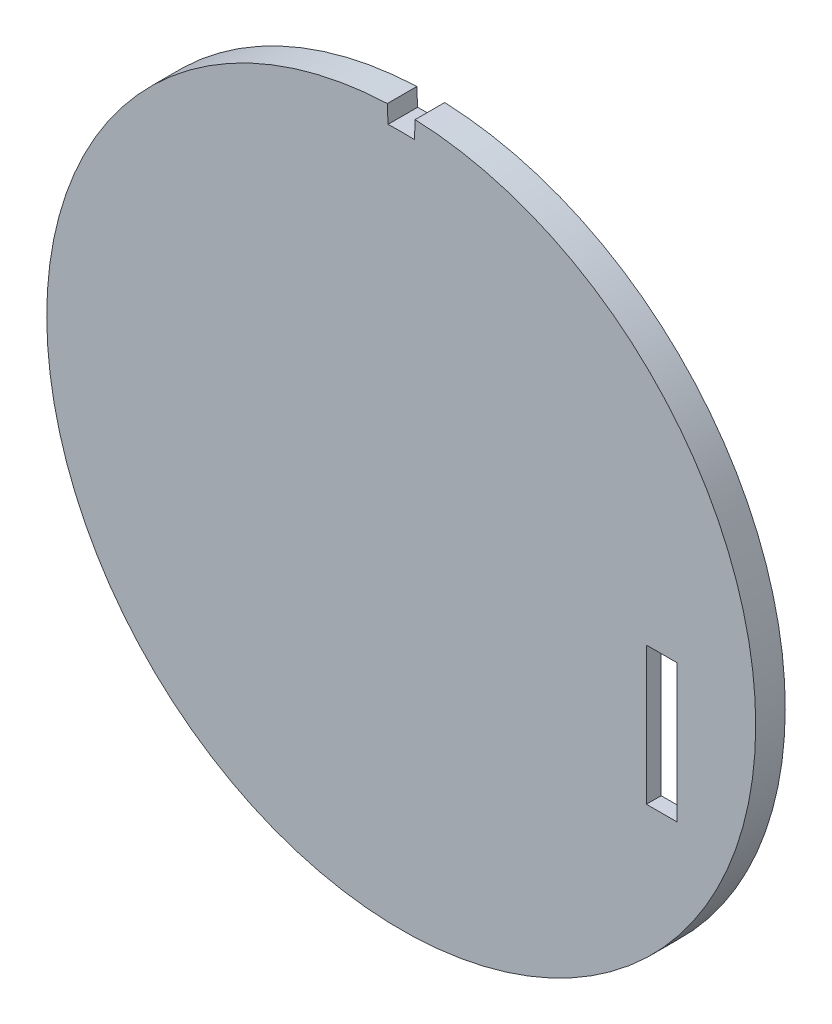
ISO-10303-21;
HEADER;
FILE_DESCRIPTION(('STEP AP214'),'2;1');
FILE_NAME('part.step','',(''),(''),'','','');
FILE_SCHEMA(('AUTOMOTIVE_DESIGN { 1 0 10303 214 1 1 1 1 }'));
ENDSEC;
DATA;
#1=APPLICATION_CONTEXT('core data for automotive mechanical design processes');
#2=APPLICATION_PROTOCOL_DEFINITION('international standard','automotive_design',2000,#1);
#3=PRODUCT_CONTEXT('',#1,'mechanical');
#4=PRODUCT('Part','Part','',(#3));
#5=PRODUCT_RELATED_PRODUCT_CATEGORY('part','',(#4));
#6=PRODUCT_DEFINITION_FORMATION('','',#4);
#7=PRODUCT_DEFINITION_CONTEXT('part definition',#1,'design');
#8=PRODUCT_DEFINITION('design','',#6,#7);
#9=PRODUCT_DEFINITION_SHAPE('','',#8);
#10=(LENGTH_UNIT() NAMED_UNIT(*) SI_UNIT(.MILLI.,.METRE.));
#11=(NAMED_UNIT(*) PLANE_ANGLE_UNIT() SI_UNIT($,.RADIAN.));
#12=(NAMED_UNIT(*) SI_UNIT($,.STERADIAN.) SOLID_ANGLE_UNIT());
#13=UNCERTAINTY_MEASURE_WITH_UNIT(LENGTH_MEASURE(1.E-05),#10,'distance_accuracy_value','');
#14=(GEOMETRIC_REPRESENTATION_CONTEXT(3) GLOBAL_UNCERTAINTY_ASSIGNED_CONTEXT((#13)) GLOBAL_UNIT_ASSIGNED_CONTEXT((#10,
#11,#12)) REPRESENTATION_CONTEXT('',''));
#15=CARTESIAN_POINT('',(0.,0.,0.));
#16=DIRECTION('',(0.,0.,1.));
#17=DIRECTION('',(1.,0.,0.));
#18=AXIS2_PLACEMENT_3D('',#15,#16,#17);
#19=CARTESIAN_POINT('',(-28.,0.,-3.));
#20=DIRECTION('',(1.,0.,0.));
#21=DIRECTION('',(0.,0.,-1.));
#22=AXIS2_PLACEMENT_3D('',#19,#20,#21);
#23=PLANE('',#22);
#24=DIRECTION('',(0.,0.,1.));
#25=VECTOR('',#24,1.);
#26=CARTESIAN_POINT('',(-28.,4.5,-3.));
#27=LINE('',#26,#25);
#28=CARTESIAN_POINT('',(-28.,4.5,-3.));
#29=VERTEX_POINT('',#28);
#30=CARTESIAN_POINT('',(-28.,4.5,-1.5));
#31=VERTEX_POINT('',#30);
#32=EDGE_CURVE('E36',#29,#31,#27,.T.);
#33=ORIENTED_EDGE('',*,*,#32,.T.);
#34=DIRECTION('',(0.,1.,0.));
#35=VECTOR('',#34,1.);
#36=CARTESIAN_POINT('',(-28.,0.,-1.5));
#37=LINE('',#36,#35);
#38=CARTESIAN_POINT('',(-28.,-17.,-1.5));
#39=VERTEX_POINT('',#38);
#40=EDGE_CURVE('E159',#39,#31,#37,.T.);
#41=ORIENTED_EDGE('',*,*,#40,.F.);
#42=DIRECTION('',(0.,0.,1.));
#43=VECTOR('',#42,1.);
#44=CARTESIAN_POINT('',(-28.,-17.,-3.));
#45=LINE('',#44,#43);
#46=CARTESIAN_POINT('',(-28.,-17.,-3.));
#47=VERTEX_POINT('',#46);
#48=EDGE_CURVE('E140',#47,#39,#45,.T.);
#49=ORIENTED_EDGE('',*,*,#48,.F.);
#50=DIRECTION('',(0.,1.,0.));
#51=VECTOR('',#50,1.);
#52=CARTESIAN_POINT('',(-28.,0.,-3.));
#53=LINE('',#52,#51);
#54=EDGE_CURVE('E136',#47,#29,#53,.T.);
#55=ORIENTED_EDGE('',*,*,#54,.T.);
#56=EDGE_LOOP('',(#33,#41,#49,#55));
#57=FACE_BOUND('',#56,.T.);
#58=ADVANCED_FACE('F33',(#57),#23,.T.);
#59=CARTESIAN_POINT('',(-22.4999999999999,-22.5,-3.));
#60=DIRECTION('',(0.707106781186546,0.707106781186549,0.));
#61=DIRECTION('',(-0.707106781186549,0.707106781186546,0.));
#62=AXIS2_PLACEMENT_3D('',#59,#60,#61);
#63=PLANE('',#62);
#64=ORIENTED_EDGE('',*,*,#48,.T.);
#65=DIRECTION('',(-0.707106781186549,0.707106781186546,0.));
#66=VECTOR('',#65,1.);
#67=CARTESIAN_POINT('',(-22.4999999999999,-22.5,-1.5));
#68=LINE('',#67,#66);
#69=CARTESIAN_POINT('',(-21.5,-23.5,-1.5));
#70=VERTEX_POINT('',#69);
#71=EDGE_CURVE('E397',#70,#39,#68,.T.);
#72=ORIENTED_EDGE('',*,*,#71,.F.);
#73=DIRECTION('',(0.,0.,1.));
#74=VECTOR('',#73,1.);
#75=CARTESIAN_POINT('',(-21.5,-23.5,-3.));
#76=LINE('',#75,#74);
#77=CARTESIAN_POINT('',(-21.5,-23.5,-3.));
#78=VERTEX_POINT('',#77);
#79=EDGE_CURVE('E143',#78,#70,#76,.T.);
#80=ORIENTED_EDGE('',*,*,#79,.F.);
#81=DIRECTION('',(-0.707106781186549,0.707106781186546,0.));
#82=VECTOR('',#81,1.);
#83=CARTESIAN_POINT('',(-22.4999999999999,-22.5,-3.));
#84=LINE('',#83,#82);
#85=EDGE_CURVE('E245',#78,#47,#84,.T.);
#86=ORIENTED_EDGE('',*,*,#85,.T.);
#87=EDGE_LOOP('',(#64,#72,#80,#86));
#88=FACE_BOUND('',#87,.T.);
#89=ADVANCED_FACE('F262',(#88),#63,.T.);
#90=CARTESIAN_POINT('',(0.,-23.5,-3.));
#91=DIRECTION('',(0.,1.,0.));
#92=DIRECTION('',(-1.,0.,0.));
#93=AXIS2_PLACEMENT_3D('',#90,#91,#92);
#94=PLANE('',#93);
#95=ORIENTED_EDGE('',*,*,#79,.T.);
#96=DIRECTION('',(-1.,0.,0.));
#97=VECTOR('',#96,1.);
#98=CARTESIAN_POINT('',(0.,-23.5,-1.5));
#99=LINE('',#98,#97);
#100=CARTESIAN_POINT('',(21.5,-23.5,-1.5));
#101=VERTEX_POINT('',#100);
#102=EDGE_CURVE('E395',#101,#70,#99,.T.);
#103=ORIENTED_EDGE('',*,*,#102,.F.);
#104=DIRECTION('',(0.,0.,1.));
#105=VECTOR('',#104,1.);
#106=CARTESIAN_POINT('',(21.5,-23.5,-3.));
#107=LINE('',#106,#105);
#108=CARTESIAN_POINT('',(21.5,-23.5,-3.));
#109=VERTEX_POINT('',#108);
#110=EDGE_CURVE('E146',#109,#101,#107,.T.);
#111=ORIENTED_EDGE('',*,*,#110,.F.);
#112=DIRECTION('',(-1.,0.,0.));
#113=VECTOR('',#112,1.);
#114=CARTESIAN_POINT('',(0.,-23.5,-3.));
#115=LINE('',#114,#113);
#116=EDGE_CURVE('E242',#109,#78,#115,.T.);
#117=ORIENTED_EDGE('',*,*,#116,.T.);
#118=EDGE_LOOP('',(#95,#103,#111,#117));
#119=FACE_BOUND('',#118,.T.);
#120=ADVANCED_FACE('F266',(#119),#94,.T.);
#121=CARTESIAN_POINT('',(22.5,-22.5,-3.));
#122=DIRECTION('',(-0.707106781186546,0.707106781186548,0.));
#123=DIRECTION('',(-0.707106781186549,-0.707106781186546,0.));
#124=AXIS2_PLACEMENT_3D('',#121,#122,#123);
#125=PLANE('',#124);
#126=ORIENTED_EDGE('',*,*,#110,.T.);
#127=DIRECTION('',(-0.707106781186549,-0.707106781186546,0.));
#128=VECTOR('',#127,1.);
#129=CARTESIAN_POINT('',(22.5,-22.5,-1.5));
#130=LINE('',#129,#128);
#131=CARTESIAN_POINT('',(28.,-17.,-1.5));
#132=VERTEX_POINT('',#131);
#133=EDGE_CURVE('E393',#132,#101,#130,.T.);
#134=ORIENTED_EDGE('',*,*,#133,.F.);
#135=DIRECTION('',(0.,0.,1.));
#136=VECTOR('',#135,1.);
#137=CARTESIAN_POINT('',(28.,-17.,-3.));
#138=LINE('',#137,#136);
#139=CARTESIAN_POINT('',(28.,-17.,-3.));
#140=VERTEX_POINT('',#139);
#141=EDGE_CURVE('E149',#140,#132,#138,.T.);
#142=ORIENTED_EDGE('',*,*,#141,.F.);
#143=DIRECTION('',(-0.707106781186549,-0.707106781186546,0.));
#144=VECTOR('',#143,1.);
#145=CARTESIAN_POINT('',(22.5,-22.5,-3.));
#146=LINE('',#145,#144);
#147=EDGE_CURVE('E239',#140,#109,#146,.T.);
#148=ORIENTED_EDGE('',*,*,#147,.T.);
#149=EDGE_LOOP('',(#126,#134,#142,#148));
#150=FACE_BOUND('',#149,.T.);
#151=ADVANCED_FACE('F272',(#150),#125,.T.);
#152=CARTESIAN_POINT('',(28.,0.,-3.));
#153=DIRECTION('',(-1.,0.,0.));
#154=DIRECTION('',(0.,-1.,0.));
#155=AXIS2_PLACEMENT_3D('',#152,#153,#154);
#156=PLANE('',#155);
#157=DIRECTION('',(0.,-1.,0.));
#158=VECTOR('',#157,1.);
#159=CARTESIAN_POINT('',(28.,0.,-1.5));
#160=LINE('',#159,#158);
#161=CARTESIAN_POINT('',(28.,-12.5,-1.5));
#162=VERTEX_POINT('',#161);
#163=EDGE_CURVE('E389',#162,#132,#160,.T.);
#164=ORIENTED_EDGE('',*,*,#163,.F.);
#165=DIRECTION('',(0.,0.,1.));
#166=VECTOR('',#165,1.);
#167=CARTESIAN_POINT('',(28.,-12.5,-1.5));
#168=LINE('',#167,#166);
#169=CARTESIAN_POINT('',(28.,-12.5,0.));
#170=VERTEX_POINT('',#169);
#171=EDGE_CURVE('E229',#162,#170,#168,.T.);
#172=ORIENTED_EDGE('',*,*,#171,.T.);
#173=DIRECTION('',(0.,-1.,0.));
#174=VECTOR('',#173,1.);
#175=CARTESIAN_POINT('',(28.,0.,0.));
#176=LINE('',#175,#174);
#177=CARTESIAN_POINT('',(28.,1.5,0.));
#178=VERTEX_POINT('',#177);
#179=EDGE_CURVE('E126',#178,#170,#176,.T.);
#180=ORIENTED_EDGE('',*,*,#179,.F.);
#181=DIRECTION('',(0.,0.,1.));
#182=VECTOR('',#181,1.);
#183=CARTESIAN_POINT('',(28.,1.5,-1.5));
#184=LINE('',#183,#182);
#185=CARTESIAN_POINT('',(28.,1.5,-1.5));
#186=VERTEX_POINT('',#185);
#187=EDGE_CURVE('E130',#186,#178,#184,.T.);
#188=ORIENTED_EDGE('',*,*,#187,.F.);
#189=CARTESIAN_POINT('',(28.,4.5,-1.5));
#190=VERTEX_POINT('',#189);
#191=EDGE_CURVE('E232',#190,#186,#160,.T.);
#192=ORIENTED_EDGE('',*,*,#191,.F.);
#193=DIRECTION('',(0.,0.,1.));
#194=VECTOR('',#193,1.);
#195=CARTESIAN_POINT('',(28.,4.5,-3.));
#196=LINE('',#195,#194);
#197=CARTESIAN_POINT('',(28.,4.5,-3.));
#198=VERTEX_POINT('',#197);
#199=EDGE_CURVE('E151',#198,#190,#196,.T.);
#200=ORIENTED_EDGE('',*,*,#199,.F.);
#201=DIRECTION('',(0.,-1.,0.));
#202=VECTOR('',#201,1.);
#203=CARTESIAN_POINT('',(28.,0.,-3.));
#204=LINE('',#203,#202);
#205=EDGE_CURVE('E236',#198,#140,#204,.T.);
#206=ORIENTED_EDGE('',*,*,#205,.T.);
#207=ORIENTED_EDGE('',*,*,#141,.T.);
#208=EDGE_LOOP('',(#164,#172,#180,#188,#192,#200,#206,#207));
#209=FACE_BOUND('',#208,.T.);
#210=ADVANCED_FACE('F280',(#209),#156,.T.);
#211=CARTESIAN_POINT('',(0.,4.5,-3.));
#212=DIRECTION('',(0.,-1.,0.));
#213=DIRECTION('',(1.,0.,0.));
#214=AXIS2_PLACEMENT_3D('',#211,#212,#213);
#215=PLANE('',#214);
#216=ORIENTED_EDGE('',*,*,#199,.T.);
#217=DIRECTION('',(1.,0.,0.));
#218=VECTOR('',#217,1.);
#219=CARTESIAN_POINT('',(0.,4.5,-1.5));
#220=LINE('',#219,#218);
#221=EDGE_CURVE('E210',#31,#190,#220,.T.);
#222=ORIENTED_EDGE('',*,*,#221,.F.);
#223=ORIENTED_EDGE('',*,*,#32,.F.);
#224=DIRECTION('',(1.,0.,0.));
#225=VECTOR('',#224,1.);
#226=CARTESIAN_POINT('',(0.,4.5,-3.));
#227=LINE('',#226,#225);
#228=EDGE_CURVE('E234',#29,#198,#227,.T.);
#229=ORIENTED_EDGE('',*,*,#228,.T.);
#230=EDGE_LOOP('',(#216,#222,#223,#229));
#231=FACE_BOUND('',#230,.T.);
#232=ADVANCED_FACE('F283',(#231),#215,.T.);
#233=CARTESIAN_POINT('',(0.,0.,-3.));
#234=DIRECTION('',(0.,0.,1.));
#235=DIRECTION('',(1.,0.,0.));
#236=AXIS2_PLACEMENT_3D('',#233,#234,#235);
#237=CYLINDRICAL_SURFACE('',#236,34.2);
#238=CARTESIAN_POINT('',(0.,0.,0.));
#239=DIRECTION('',(0.,0.,1.));
#240=DIRECTION('',(1.,0.,0.));
#241=AXIS2_PLACEMENT_3D('',#238,#239,#240);
#242=CIRCLE('',#241,34.2);
#243=CARTESIAN_POINT('',(-1.34268569896003,34.1736330394327,0.));
#244=VERTEX_POINT('',#243);
#245=CARTESIAN_POINT('',(1.34268569896004,34.1736330394327,0.));
#246=VERTEX_POINT('',#245);
#247=EDGE_CURVE('E129',#244,#246,#242,.F.);
#248=ORIENTED_EDGE('',*,*,#247,.T.);
#249=DIRECTION('',(0.,0.,1.));
#250=VECTOR('',#249,1.);
#251=CARTESIAN_POINT('',(1.34268569896004,34.1736330394327,-3.));
#252=LINE('',#251,#250);
#253=CARTESIAN_POINT('',(1.34268569896004,34.1736330394327,-3.));
#254=VERTEX_POINT('',#253);
#255=EDGE_CURVE('E11',#254,#246,#252,.T.);
#256=ORIENTED_EDGE('',*,*,#255,.F.);
#257=CARTESIAN_POINT('',(0.,0.,-3.));
#258=DIRECTION('',(0.,0.,1.));
#259=DIRECTION('',(1.,0.,0.));
#260=AXIS2_PLACEMENT_3D('',#257,#258,#259);
#261=CIRCLE('',#260,34.2);
#262=CARTESIAN_POINT('',(-1.34268569896003,34.1736330394327,-3.));
#263=VERTEX_POINT('',#262);
#264=EDGE_CURVE('E119',#263,#254,#261,.F.);
#265=ORIENTED_EDGE('',*,*,#264,.F.);
#266=DIRECTION('',(0.,0.,1.));
#267=VECTOR('',#266,1.);
#268=CARTESIAN_POINT('',(-1.34268569896003,34.1736330394327,-3.));
#269=LINE('',#268,#267);
#270=EDGE_CURVE('E111',#263,#244,#269,.T.);
#271=ORIENTED_EDGE('',*,*,#270,.T.);
#272=EDGE_LOOP('',(#248,#256,#265,#271));
#273=FACE_BOUND('',#272,.T.);
#274=ADVANCED_FACE('F249',(#273),#237,.T.);
#275=CARTESIAN_POINT('',(-2.32490406242338E-13,0.,-3.));
#276=DIRECTION('',(0.999229036240723,-0.0392598157590722,0.));
#277=DIRECTION('',(0.0392598157590722,0.999229036240723,0.));
#278=AXIS2_PLACEMENT_3D('',#275,#276,#277);
#279=PLANE('',#278);
#280=DIRECTION('',(0.0392598157590722,0.999229036240723,0.));
#281=VECTOR('',#280,1.);
#282=CARTESIAN_POINT('',(-2.32490406242338E-13,0.,0.));
#283=LINE('',#282,#281);
#284=CARTESIAN_POINT('',(1.41335336732637,35.972245304666,0.));
#285=VERTEX_POINT('',#284);
#286=EDGE_CURVE('E73',#246,#285,#283,.T.);
#287=ORIENTED_EDGE('',*,*,#286,.T.);
#288=DIRECTION('',(0.,0.,1.));
#289=VECTOR('',#288,1.);
#290=CARTESIAN_POINT('',(1.41335336732637,35.972245304666,-3.));
#291=LINE('',#290,#289);
#292=CARTESIAN_POINT('',(1.41335336732637,35.972245304666,-3.));
#293=VERTEX_POINT('',#292);
#294=EDGE_CURVE('E42',#293,#285,#291,.T.);
#295=ORIENTED_EDGE('',*,*,#294,.F.);
#296=DIRECTION('',(0.0392598157590722,0.999229036240723,0.));
#297=VECTOR('',#296,1.);
#298=CARTESIAN_POINT('',(-2.32490406242338E-13,0.,-3.));
#299=LINE('',#298,#297);
#300=EDGE_CURVE('E50',#254,#293,#299,.T.);
#301=ORIENTED_EDGE('',*,*,#300,.F.);
#302=ORIENTED_EDGE('',*,*,#255,.T.);
#303=EDGE_LOOP('',(#287,#295,#301,#302));
#304=FACE_BOUND('',#303,.T.);
#305=ADVANCED_FACE('F250',(#304),#279,.F.);
#306=CARTESIAN_POINT('',(0.,0.,-3.));
#307=DIRECTION('',(0.,0.,1.));
#308=DIRECTION('',(1.,0.,0.));
#309=AXIS2_PLACEMENT_3D('',#306,#307,#308);
#310=CYLINDRICAL_SURFACE('',#309,36.);
#311=CARTESIAN_POINT('',(0.,0.,0.));
#312=DIRECTION('',(0.,0.,1.));
#313=DIRECTION('',(1.,0.,0.));
#314=AXIS2_PLACEMENT_3D('',#311,#312,#313);
#315=CIRCLE('',#314,36.);
#316=CARTESIAN_POINT('',(-1.41335336732635,35.972245304666,0.));
#317=VERTEX_POINT('',#316);
#318=EDGE_CURVE('E108',#317,#285,#315,.T.);
#319=ORIENTED_EDGE('',*,*,#318,.F.);
#320=DIRECTION('',(0.,0.,1.));
#321=VECTOR('',#320,1.);
#322=CARTESIAN_POINT('',(-1.41335336732635,35.972245304666,-3.));
#323=LINE('',#322,#321);
#324=CARTESIAN_POINT('',(-1.41335336732635,35.972245304666,-3.));
#325=VERTEX_POINT('',#324);
#326=EDGE_CURVE('E103',#325,#317,#323,.T.);
#327=ORIENTED_EDGE('',*,*,#326,.F.);
#328=CARTESIAN_POINT('',(0.,0.,-3.));
#329=DIRECTION('',(0.,0.,1.));
#330=DIRECTION('',(1.,0.,0.));
#331=AXIS2_PLACEMENT_3D('',#328,#329,#330);
#332=CIRCLE('',#331,36.);
#333=EDGE_CURVE('E107',#325,#293,#332,.T.);
#334=ORIENTED_EDGE('',*,*,#333,.T.);
#335=ORIENTED_EDGE('',*,*,#294,.T.);
#336=EDGE_LOOP('',(#319,#327,#334,#335));
#337=FACE_BOUND('',#336,.T.);
#338=ADVANCED_FACE('F105',(#337),#310,.T.);
#339=CARTESIAN_POINT('',(0.,0.,-3.));
#340=DIRECTION('',(-0.999229036240723,-0.0392598157590649,0.));
#341=DIRECTION('',(0.0392598157590649,-0.999229036240723,0.));
#342=AXIS2_PLACEMENT_3D('',#339,#340,#341);
#343=PLANE('',#342);
#344=DIRECTION('',(0.0392598157590649,-0.999229036240723,0.));
#345=VECTOR('',#344,1.);
#346=CARTESIAN_POINT('',(0.,0.,0.));
#347=LINE('',#346,#345);
#348=EDGE_CURVE('E133',#317,#244,#347,.T.);
#349=ORIENTED_EDGE('',*,*,#348,.T.);
#350=ORIENTED_EDGE('',*,*,#270,.F.);
#351=DIRECTION('',(0.0392598157590649,-0.999229036240723,0.));
#352=VECTOR('',#351,1.);
#353=CARTESIAN_POINT('',(0.,0.,-3.));
#354=LINE('',#353,#352);
#355=EDGE_CURVE('E114',#325,#263,#354,.T.);
#356=ORIENTED_EDGE('',*,*,#355,.F.);
#357=ORIENTED_EDGE('',*,*,#326,.T.);
#358=EDGE_LOOP('',(#349,#350,#356,#357));
#359=FACE_BOUND('',#358,.T.);
#360=ADVANCED_FACE('F115',(#359),#343,.F.);
#361=CARTESIAN_POINT('',(0.,0.,-3.));
#362=DIRECTION('',(0.,0.,1.));
#363=DIRECTION('',(1.,0.,0.));
#364=AXIS2_PLACEMENT_3D('',#361,#362,#363);
#365=PLANE('',#364);
#366=ORIENTED_EDGE('',*,*,#54,.F.);
#367=ORIENTED_EDGE('',*,*,#85,.F.);
#368=ORIENTED_EDGE('',*,*,#116,.F.);
#369=ORIENTED_EDGE('',*,*,#147,.F.);
#370=ORIENTED_EDGE('',*,*,#205,.F.);
#371=ORIENTED_EDGE('',*,*,#228,.F.);
#372=EDGE_LOOP('',(#366,#367,#368,#369,#370,#371));
#373=FACE_BOUND('',#372,.T.);
#374=ORIENTED_EDGE('',*,*,#264,.T.);
#375=ORIENTED_EDGE('',*,*,#300,.T.);
#376=ORIENTED_EDGE('',*,*,#333,.F.);
#377=ORIENTED_EDGE('',*,*,#355,.T.);
#378=EDGE_LOOP('',(#374,#375,#376,#377));
#379=FACE_BOUND('',#378,.T.);
#380=ADVANCED_FACE('F121',(#373,#379),#365,.F.);
#381=CARTESIAN_POINT('',(0.,0.,0.));
#382=DIRECTION('',(0.,0.,1.));
#383=DIRECTION('',(1.,0.,0.));
#384=AXIS2_PLACEMENT_3D('',#381,#382,#383);
#385=PLANE('',#384);
#386=DIRECTION('',(-1.,0.,0.));
#387=VECTOR('',#386,1.);
#388=CARTESIAN_POINT('',(0.,1.5,0.));
#389=LINE('',#388,#387);
#390=CARTESIAN_POINT('',(24.9,1.5,0.));
#391=VERTEX_POINT('',#390);
#392=EDGE_CURVE('E200',#178,#391,#389,.T.);
#393=ORIENTED_EDGE('',*,*,#392,.F.);
#394=ORIENTED_EDGE('',*,*,#179,.T.);
#395=DIRECTION('',(1.,0.,0.));
#396=VECTOR('',#395,1.);
#397=CARTESIAN_POINT('',(0.,-12.5,0.));
#398=LINE('',#397,#396);
#399=CARTESIAN_POINT('',(24.9,-12.5,0.));
#400=VERTEX_POINT('',#399);
#401=EDGE_CURVE('E222',#400,#170,#398,.T.);
#402=ORIENTED_EDGE('',*,*,#401,.F.);
#403=DIRECTION('',(0.,-1.,0.));
#404=VECTOR('',#403,1.);
#405=CARTESIAN_POINT('',(24.9,0.,0.));
#406=LINE('',#405,#404);
#407=EDGE_CURVE('E211',#391,#400,#406,.T.);
#408=ORIENTED_EDGE('',*,*,#407,.F.);
#409=EDGE_LOOP('',(#393,#394,#402,#408));
#410=FACE_BOUND('',#409,.T.);
#411=ORIENTED_EDGE('',*,*,#247,.F.);
#412=ORIENTED_EDGE('',*,*,#348,.F.);
#413=ORIENTED_EDGE('',*,*,#318,.T.);
#414=ORIENTED_EDGE('',*,*,#286,.F.);
#415=EDGE_LOOP('',(#411,#412,#413,#414));
#416=FACE_BOUND('',#415,.T.);
#417=ADVANCED_FACE('F221',(#410,#416),#385,.T.);
#418=CARTESIAN_POINT('',(0.,1.5,-1.5));
#419=DIRECTION('',(0.,1.,0.));
#420=DIRECTION('',(-1.,0.,0.));
#421=AXIS2_PLACEMENT_3D('',#418,#419,#420);
#422=PLANE('',#421);
#423=ORIENTED_EDGE('',*,*,#392,.T.);
#424=DIRECTION('',(0.,0.,1.));
#425=VECTOR('',#424,1.);
#426=CARTESIAN_POINT('',(24.9,1.5,-1.5));
#427=LINE('',#426,#425);
#428=CARTESIAN_POINT('',(24.9,1.5,-1.5));
#429=VERTEX_POINT('',#428);
#430=EDGE_CURVE('E204',#429,#391,#427,.T.);
#431=ORIENTED_EDGE('',*,*,#430,.F.);
#432=DIRECTION('',(-1.,0.,0.));
#433=VECTOR('',#432,1.);
#434=CARTESIAN_POINT('',(0.,1.5,-1.5));
#435=LINE('',#434,#433);
#436=EDGE_CURVE('E387',#186,#429,#435,.T.);
#437=ORIENTED_EDGE('',*,*,#436,.F.);
#438=ORIENTED_EDGE('',*,*,#187,.T.);
#439=EDGE_LOOP('',(#423,#431,#437,#438));
#440=FACE_BOUND('',#439,.T.);
#441=ADVANCED_FACE('F202',(#440),#422,.F.);
#442=CARTESIAN_POINT('',(24.9,0.,-1.5));
#443=DIRECTION('',(-1.,0.,0.));
#444=DIRECTION('',(0.,0.,1.));
#445=AXIS2_PLACEMENT_3D('',#442,#443,#444);
#446=PLANE('',#445);
#447=ORIENTED_EDGE('',*,*,#407,.T.);
#448=DIRECTION('',(0.,0.,1.));
#449=VECTOR('',#448,1.);
#450=CARTESIAN_POINT('',(24.9,-12.5,-1.5));
#451=LINE('',#450,#449);
#452=CARTESIAN_POINT('',(24.9,-12.5,-1.5));
#453=VERTEX_POINT('',#452);
#454=EDGE_CURVE('E218',#453,#400,#451,.T.);
#455=ORIENTED_EDGE('',*,*,#454,.F.);
#456=DIRECTION('',(0.,-1.,0.));
#457=VECTOR('',#456,1.);
#458=CARTESIAN_POINT('',(24.9,0.,-1.5));
#459=LINE('',#458,#457);
#460=EDGE_CURVE('E217',#429,#453,#459,.T.);
#461=ORIENTED_EDGE('',*,*,#460,.F.);
#462=ORIENTED_EDGE('',*,*,#430,.T.);
#463=EDGE_LOOP('',(#447,#455,#461,#462));
#464=FACE_BOUND('',#463,.T.);
#465=ADVANCED_FACE('F214',(#464),#446,.F.);
#466=CARTESIAN_POINT('',(0.,-12.5,-1.5));
#467=DIRECTION('',(0.,-1.,0.));
#468=DIRECTION('',(0.,0.,-1.));
#469=AXIS2_PLACEMENT_3D('',#466,#467,#468);
#470=PLANE('',#469);
#471=ORIENTED_EDGE('',*,*,#401,.T.);
#472=ORIENTED_EDGE('',*,*,#171,.F.);
#473=DIRECTION('',(1.,0.,0.));
#474=VECTOR('',#473,1.);
#475=CARTESIAN_POINT('',(0.,-12.5,-1.5));
#476=LINE('',#475,#474);
#477=EDGE_CURVE('E392',#453,#162,#476,.T.);
#478=ORIENTED_EDGE('',*,*,#477,.F.);
#479=ORIENTED_EDGE('',*,*,#454,.T.);
#480=EDGE_LOOP('',(#471,#472,#478,#479));
#481=FACE_BOUND('',#480,.T.);
#482=ADVANCED_FACE('F358',(#481),#470,.F.);
#483=CARTESIAN_POINT('',(0.,0.,-1.5));
#484=DIRECTION('',(0.,0.,1.));
#485=DIRECTION('',(1.,0.,0.));
#486=AXIS2_PLACEMENT_3D('',#483,#484,#485);
#487=PLANE('',#486);
#488=ORIENTED_EDGE('',*,*,#221,.T.);
#489=ORIENTED_EDGE('',*,*,#191,.T.);
#490=ORIENTED_EDGE('',*,*,#436,.T.);
#491=ORIENTED_EDGE('',*,*,#460,.T.);
#492=ORIENTED_EDGE('',*,*,#477,.T.);
#493=ORIENTED_EDGE('',*,*,#163,.T.);
#494=ORIENTED_EDGE('',*,*,#133,.T.);
#495=ORIENTED_EDGE('',*,*,#102,.T.);
#496=ORIENTED_EDGE('',*,*,#71,.T.);
#497=ORIENTED_EDGE('',*,*,#40,.T.);
#498=EDGE_LOOP('',(#488,#489,#490,#491,#492,#493,#494,#495,#496,#497));
#499=FACE_BOUND('',#498,.T.);
#500=ADVANCED_FACE('F367',(#499),#487,.F.);
#501=CLOSED_SHELL('',(#58,#89,#120,#151,#210,#232,#274,#305,#338,#360,#380,#417,#441,#465,#482,#500));
#502=MANIFOLD_SOLID_BREP('B2',#501);
#503=ADVANCED_BREP_SHAPE_REPRESENTATION('',(#18,#502),#14);
#504=SHAPE_DEFINITION_REPRESENTATION(#9,#503);
ENDSEC;
END-ISO-10303-21;
